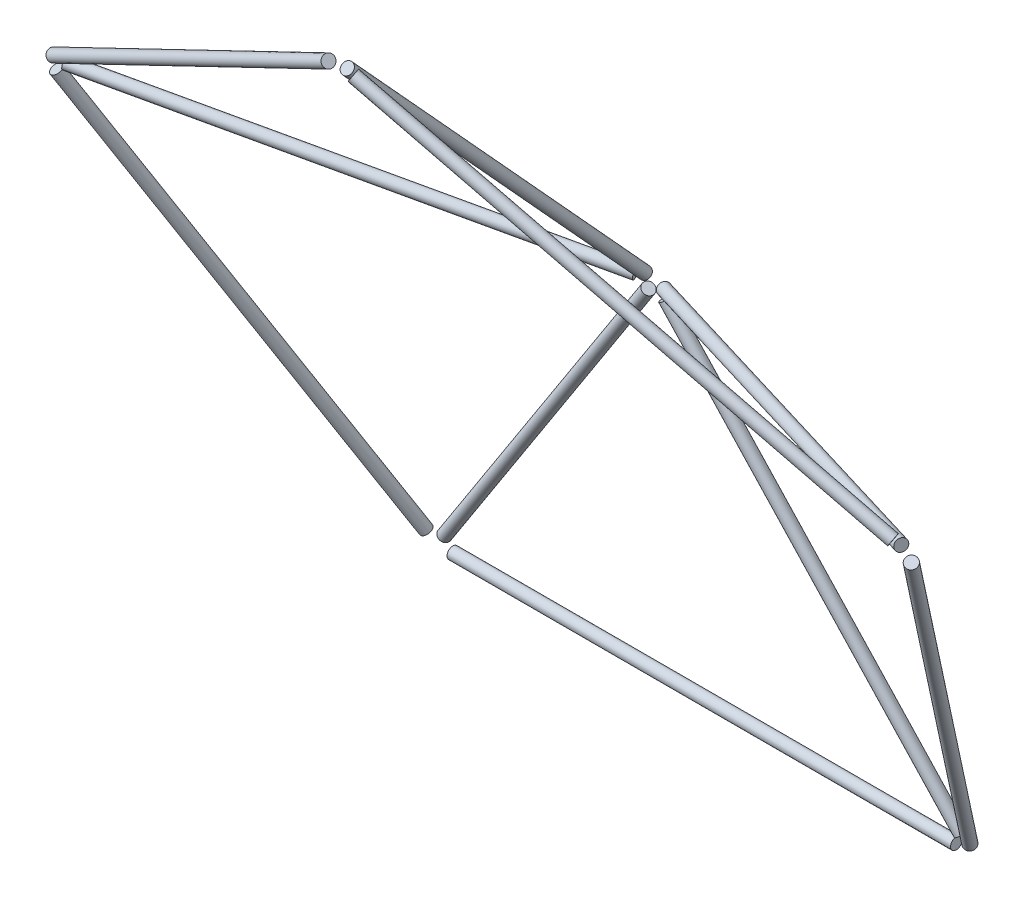
ISO-10303-21;
HEADER;
FILE_DESCRIPTION(('STEP AP214'),'2;1');
FILE_NAME('part.step','',(''),(''),'','','');
FILE_SCHEMA(('AUTOMOTIVE_DESIGN { 1 0 10303 214 1 1 1 1 }'));
ENDSEC;
DATA;
#1=APPLICATION_CONTEXT('core data for automotive mechanical design processes');
#2=APPLICATION_PROTOCOL_DEFINITION('international standard','automotive_design',2000,#1);
#3=PRODUCT_CONTEXT('',#1,'mechanical');
#4=PRODUCT('Part','Part','',(#3));
#5=PRODUCT_RELATED_PRODUCT_CATEGORY('part','',(#4));
#6=PRODUCT_DEFINITION_FORMATION('','',#4);
#7=PRODUCT_DEFINITION_CONTEXT('part definition',#1,'design');
#8=PRODUCT_DEFINITION('design','',#6,#7);
#9=PRODUCT_DEFINITION_SHAPE('','',#8);
#10=(LENGTH_UNIT() NAMED_UNIT(*) SI_UNIT(.MILLI.,.METRE.));
#11=(NAMED_UNIT(*) PLANE_ANGLE_UNIT() SI_UNIT($,.RADIAN.));
#12=(NAMED_UNIT(*) SI_UNIT($,.STERADIAN.) SOLID_ANGLE_UNIT());
#13=UNCERTAINTY_MEASURE_WITH_UNIT(LENGTH_MEASURE(1.E-05),#10,'distance_accuracy_value','');
#14=(GEOMETRIC_REPRESENTATION_CONTEXT(3) GLOBAL_UNCERTAINTY_ASSIGNED_CONTEXT((#13)) GLOBAL_UNIT_ASSIGNED_CONTEXT((#10,
#11,#12)) REPRESENTATION_CONTEXT('',''));
#15=CARTESIAN_POINT('',(0.,0.,0.));
#16=DIRECTION('',(0.,0.,1.));
#17=DIRECTION('',(1.,0.,0.));
#18=AXIS2_PLACEMENT_3D('',#15,#16,#17);
#19=CARTESIAN_POINT('',(3.23606797750099,189.293507430732,-119.340962451044));
#20=DIRECTION('',(0.809016994374942,-0.525731112119142,-0.262865556059568));
#21=DIRECTION('',(0.,0.447213595499955,-0.894427190999917));
#22=AXIS2_PLACEMENT_3D('',#19,#20,#21);
#23=PLANE('',#22);
#24=CARTESIAN_POINT('',(3.23606797750099,189.293507430732,-119.340962451044));
#25=DIRECTION('',(0.809016994374942,-0.525731112119142,-0.262865556059568));
#26=DIRECTION('',(0.,0.447213595499955,-0.894427190999917));
#27=AXIS2_PLACEMENT_3D('',#24,#25,#26);
#28=CIRCLE('',#27,1.49999999999999);
#29=CARTESIAN_POINT('',(3.23606797750099,189.964327823982,-120.682603237544));
#30=VERTEX_POINT('',#29);
#31=EDGE_CURVE('E52',#30,#30,#28,.T.);
#32=ORIENTED_EDGE('',*,*,#31,.F.);
#33=EDGE_LOOP('',(#32));
#34=FACE_BOUND('',#33,.T.);
#35=ADVANCED_FACE('F46',(#34),#23,.F.);
#36=CARTESIAN_POINT('',(109.263932022501,120.39242467528,-153.79150382877));
#37=DIRECTION('',(0.809016994374942,-0.525731112119142,-0.262865556059568));
#38=DIRECTION('',(0.,0.447213595499955,-0.894427190999917));
#39=AXIS2_PLACEMENT_3D('',#36,#37,#38);
#40=PLANE('',#39);
#41=CARTESIAN_POINT('',(109.263932022501,120.39242467528,-153.79150382877));
#42=DIRECTION('',(0.809016994374942,-0.525731112119142,-0.262865556059568));
#43=DIRECTION('',(0.,0.447213595499955,-0.894427190999917));
#44=AXIS2_PLACEMENT_3D('',#41,#42,#43);
#45=CIRCLE('',#44,1.49999999999999);
#46=CARTESIAN_POINT('',(109.263932022501,121.06324506853,-155.13314461527));
#47=VERTEX_POINT('',#46);
#48=EDGE_CURVE('E11',#47,#47,#45,.T.);
#49=ORIENTED_EDGE('',*,*,#48,.T.);
#50=EDGE_LOOP('',(#49));
#51=FACE_BOUND('',#50,.T.);
#52=ADVANCED_FACE('F61',(#51),#40,.T.);
#53=CARTESIAN_POINT('',(3.23606797750099,189.293507430732,-119.340962451044));
#54=DIRECTION('',(0.809016994374942,-0.525731112119141,-0.262865556059567));
#55=DIRECTION('',(0.,0.447213595499955,-0.894427190999917));
#56=AXIS2_PLACEMENT_3D('',#53,#54,#55);
#57=CYLINDRICAL_SURFACE('',#56,1.49999999999999);
#58=ORIENTED_EDGE('',*,*,#48,.F.);
#59=EDGE_LOOP('',(#58));
#60=FACE_BOUND('',#59,.T.);
#61=ORIENTED_EDGE('',*,*,#31,.T.);
#62=EDGE_LOOP('',(#61));
#63=FACE_BOUND('',#62,.T.);
#64=ADVANCED_FACE('F58',(#60,#63),#57,.T.);
#65=CLOSED_SHELL('',(#35,#52,#64));
#66=MANIFOLD_SOLID_BREP('B2',#65);
#67=CARTESIAN_POINT('',(-109.263932022499,120.392424675282,-153.791503828769));
#68=DIRECTION('',(0.809016994374952,0.525731112119127,0.262865556059566));
#69=DIRECTION('',(0.,0.447213595499955,-0.894427190999917));
#70=AXIS2_PLACEMENT_3D('',#67,#68,#69);
#71=PLANE('',#70);
#72=CARTESIAN_POINT('',(-109.263932022499,120.392424675282,-153.791503828769));
#73=DIRECTION('',(0.809016994374952,0.525731112119127,0.262865556059566));
#74=DIRECTION('',(0.,0.447213595499955,-0.894427190999917));
#75=AXIS2_PLACEMENT_3D('',#72,#73,#74);
#76=CIRCLE('',#75,1.49999999999999);
#77=CARTESIAN_POINT('',(-109.263932022499,121.063245068532,-155.133144615269));
#78=VERTEX_POINT('',#77);
#79=EDGE_CURVE('E101',#78,#78,#76,.T.);
#80=ORIENTED_EDGE('',*,*,#79,.F.);
#81=EDGE_LOOP('',(#80));
#82=FACE_BOUND('',#81,.T.);
#83=ADVANCED_FACE('F95',(#82),#71,.F.);
#84=CARTESIAN_POINT('',(-3.23606797749813,189.293507430732,-119.340962451044));
#85=DIRECTION('',(0.809016994374952,0.525731112119127,0.262865556059566));
#86=DIRECTION('',(0.,0.447213595499955,-0.894427190999917));
#87=AXIS2_PLACEMENT_3D('',#84,#85,#86);
#88=PLANE('',#87);
#89=CARTESIAN_POINT('',(-3.23606797749813,189.293507430732,-119.340962451044));
#90=DIRECTION('',(0.809016994374952,0.525731112119127,0.262865556059566));
#91=DIRECTION('',(0.,0.447213595499955,-0.894427190999917));
#92=AXIS2_PLACEMENT_3D('',#89,#90,#91);
#93=CIRCLE('',#92,1.49999999999999);
#94=CARTESIAN_POINT('',(-3.23606797749813,189.964327823982,-120.682603237544));
#95=VERTEX_POINT('',#94);
#96=EDGE_CURVE('E45',#95,#95,#93,.T.);
#97=ORIENTED_EDGE('',*,*,#96,.T.);
#98=EDGE_LOOP('',(#97));
#99=FACE_BOUND('',#98,.T.);
#100=ADVANCED_FACE('F110',(#99),#88,.T.);
#101=CARTESIAN_POINT('',(-109.263932022499,120.392424675282,-153.791503828769));
#102=DIRECTION('',(0.809016994374951,0.525731112119128,0.262865556059566));
#103=DIRECTION('',(0.,0.447213595499955,-0.894427190999917));
#104=AXIS2_PLACEMENT_3D('',#101,#102,#103);
#105=CYLINDRICAL_SURFACE('',#104,1.49999999999999);
#106=CARTESIAN_POINT('',(-3.23606797749813,189.964327823982,-120.682603237544));
#107=CARTESIAN_POINT('',(-4.34052489463356,189.246608211946,-121.041463043562));
#108=CARTESIAN_POINT('',(-5.44498181176898,188.52888859991,-121.40032284958));
#109=CARTESIAN_POINT('',(-7.65389564603983,187.093449375838,-122.118042461616));
#110=CARTESIAN_POINT('',(-8.75835256317526,186.375729763802,-122.476902267634));
#111=CARTESIAN_POINT('',(-10.9672663974461,184.94029053973,-123.19462187967));
#112=CARTESIAN_POINT('',(-12.0717233145815,184.222570927695,-123.553481685688));
#113=CARTESIAN_POINT('',(-14.2806371488524,182.787131703623,-124.271201297724));
#114=CARTESIAN_POINT('',(-15.3850940659878,182.069412091587,-124.630061103742));
#115=CARTESIAN_POINT('',(-17.5940079002587,180.633972867515,-125.347780715778));
#116=CARTESIAN_POINT('',(-18.6984648173941,179.916253255479,-125.706640521796));
#117=CARTESIAN_POINT('',(-20.907378651665,178.480814031407,-126.424360133832));
#118=CARTESIAN_POINT('',(-22.0118355688004,177.763094419371,-126.78321993985));
#119=CARTESIAN_POINT('',(-24.2207494030712,176.327655195299,-127.500939551885));
#120=CARTESIAN_POINT('',(-25.3252063202067,175.609935583263,-127.859799357903));
#121=CARTESIAN_POINT('',(-27.5341201544775,174.174496359191,-128.577518969939));
#122=CARTESIAN_POINT('',(-28.6385770716129,173.456776747155,-128.936378775957));
#123=CARTESIAN_POINT('',(-30.8474909058838,172.021337523084,-129.654098387993));
#124=CARTESIAN_POINT('',(-31.9519478230192,171.303617911048,-130.012958194011));
#125=CARTESIAN_POINT('',(-34.1608616572901,169.868178686976,-130.730677806047));
#126=CARTESIAN_POINT('',(-35.2653185744255,169.15045907494,-131.089537612065));
#127=CARTESIAN_POINT('',(-37.4742324086964,167.715019850868,-131.807257224101));
#128=CARTESIAN_POINT('',(-38.5786893258318,166.997300238832,-132.166117030119));
#129=CARTESIAN_POINT('',(-40.7876031601026,165.56186101476,-132.883836642155));
#130=CARTESIAN_POINT('',(-41.8920600772381,164.844141402724,-133.242696448173));
#131=CARTESIAN_POINT('',(-44.1009739115089,163.408702178652,-133.960416060209));
#132=CARTESIAN_POINT('',(-45.2054308286443,162.690982566616,-134.319275866227));
#133=CARTESIAN_POINT('',(-47.4143446629152,161.255543342545,-135.036995478263));
#134=CARTESIAN_POINT('',(-48.5188015800506,160.537823730509,-135.395855284281));
#135=CARTESIAN_POINT('',(-50.7277154143215,159.102384506437,-136.113574896317));
#136=CARTESIAN_POINT('',(-51.8321723314569,158.384664894401,-136.472434702335));
#137=CARTESIAN_POINT('',(-54.0410861657277,156.949225670329,-137.190154314371));
#138=CARTESIAN_POINT('',(-55.1455430828632,156.231506058293,-137.549014120389));
#139=CARTESIAN_POINT('',(-57.354456917134,154.796066834221,-138.266733732425));
#140=CARTESIAN_POINT('',(-58.4589138342695,154.078347222185,-138.625593538443));
#141=CARTESIAN_POINT('',(-60.6678276685403,152.642907998113,-139.343313150479));
#142=CARTESIAN_POINT('',(-61.7722845856757,151.925188386077,-139.702172956496));
#143=CARTESIAN_POINT('',(-63.9811984199466,150.489749162005,-140.419892568532));
#144=CARTESIAN_POINT('',(-65.085655337082,149.77202954997,-140.77875237455));
#145=CARTESIAN_POINT('',(-67.2945691713529,148.336590325898,-141.496471986586));
#146=CARTESIAN_POINT('',(-68.3990260884883,147.618870713862,-141.855331792604));
#147=CARTESIAN_POINT('',(-70.6079399227591,146.18343148979,-142.57305140464));
#148=CARTESIAN_POINT('',(-71.7123968398946,145.465711877754,-142.931911210658));
#149=CARTESIAN_POINT('',(-73.9213106741654,144.030272653682,-143.649630822694));
#150=CARTESIAN_POINT('',(-75.0257675913008,143.312553041646,-144.008490628712));
#151=CARTESIAN_POINT('',(-77.2346814255717,141.877113817574,-144.726210240748));
#152=CARTESIAN_POINT('',(-78.3391383427071,141.159394205538,-145.085070046766));
#153=CARTESIAN_POINT('',(-80.548052176978,139.723954981466,-145.802789658802));
#154=CARTESIAN_POINT('',(-81.6525090941134,139.00623536943,-146.16164946482));
#155=CARTESIAN_POINT('',(-83.8614229283843,137.570796145359,-146.879369076856));
#156=CARTESIAN_POINT('',(-84.9658798455197,136.853076533323,-147.238228882874));
#157=CARTESIAN_POINT('',(-87.1747936797905,135.417637309251,-147.95594849491));
#158=CARTESIAN_POINT('',(-88.279250596926,134.699917697215,-148.314808300928));
#159=CARTESIAN_POINT('',(-90.4881644311968,133.264478473143,-149.032527912964));
#160=CARTESIAN_POINT('',(-91.5926213483322,132.546758861107,-149.391387718982));
#161=CARTESIAN_POINT('',(-93.8015351826031,131.111319637035,-150.109107331018));
#162=CARTESIAN_POINT('',(-94.9059920997385,130.393600024999,-150.467967137036));
#163=CARTESIAN_POINT('',(-97.1149059340094,128.958160800927,-151.185686749072));
#164=CARTESIAN_POINT('',(-98.2193628511448,128.240441188891,-151.54454655509));
#165=CARTESIAN_POINT('',(-100.428276685416,126.805001964819,-152.262266167126));
#166=CARTESIAN_POINT('',(-101.532733602551,126.087282352783,-152.621125973144));
#167=CARTESIAN_POINT('',(-103.741647436822,124.651843128712,-153.338845585179));
#168=CARTESIAN_POINT('',(-104.846104353957,123.934123516676,-153.697705391197));
#169=CARTESIAN_POINT('',(-107.055018188228,122.498684292604,-154.415425003233));
#170=CARTESIAN_POINT('',(-108.159475105364,121.780964680568,-154.774284809251));
#171=CARTESIAN_POINT('',(-109.263932022499,121.063245068532,-155.133144615269));
#172=B_SPLINE_CURVE_WITH_KNOTS('',3,(#106,#107,#108,#109,#110,#111,#112,#113,#114,#115,#116,
#117,#118,#119,#120,#121,#122,#123,#124,#125,#126,#127,#128,#129,#130,#131,#132,#133,#134,#135,
#136,#137,#138,#139,#140,#141,#142,#143,#144,#145,#146,#147,#148,#149,#150,#151,#152,#153,#154,
#155,#156,#157,#158,#159,#160,#161,#162,#163,#164,#165,#166,#167,#168,#169,#170,#171),
.UNSPECIFIED.,.F.,.F.,(4,2,2,2,2,2,2,2,2,2,2,2,2,2,2,2,2,2,2,2,2,2,2,2,2,2,2,2,2,2,2,2,4),(0.,
4.09555148339769,8.19110296679541,12.2866544501931,16.3822059335908,20.4777574169885,
24.5733089003862,28.6688603837839,32.7644118671816,36.8599633505793,40.955514833977,
45.0510663173747,49.1466178007724,53.2421692841701,57.3377207675678,61.4332722509655,
65.5288237343632,69.6243752177609,73.7199267011586,77.8154781845563,81.911029667954,
86.0065811513517,90.1021326347494,94.1976841181471,98.2932356015448,102.388787084942,
106.48433856834,110.579890051738,114.675441535136,118.770993018533,122.866544501931,
126.962095985329,131.057647468726),.UNSPECIFIED.);
#173=EDGE_CURVE('BSEAM107',#95,#78,#172,.T.);
#174=ORIENTED_EDGE('',*,*,#96,.F.);
#175=ORIENTED_EDGE('',*,*,#79,.T.);
#176=ORIENTED_EDGE('',*,*,#173,.T.);
#177=ORIENTED_EDGE('',*,*,#173,.F.);
#178=EDGE_LOOP('',(#174,#176,#175,#177));
#179=FACE_BOUND('',#178,.T.);
#180=ADVANCED_FACE('F107',(#179),#105,.T.);
#181=CLOSED_SHELL('',(#83,#100,#180));
#182=MANIFOLD_SOLID_BREP('B6',#181);
#183=CARTESIAN_POINT('',(-70.7648917118622,3.40260323340869,-212.286414549706));
#184=DIRECTION('',(-0.309016994374944,0.850650808352041,0.425325404176019));
#185=DIRECTION('',(0.,0.447213595499958,-0.894427190999916));
#186=AXIS2_PLACEMENT_3D('',#183,#184,#185);
#187=PLANE('',#186);
#188=CARTESIAN_POINT('',(-70.7648917118622,3.40260323340869,-212.286414549706));
#189=DIRECTION('',(-0.309016994374944,0.850650808352041,0.425325404176019));
#190=DIRECTION('',(0.,0.447213595499958,-0.894427190999916));
#191=AXIS2_PLACEMENT_3D('',#188,#189,#190);
#192=CIRCLE('',#191,1.49999999999999);
#193=CARTESIAN_POINT('',(-70.7648917118622,4.07342362665862,-213.628055336206));
#194=VERTEX_POINT('',#193);
#195=EDGE_CURVE('E150',#194,#194,#192,.T.);
#196=ORIENTED_EDGE('',*,*,#195,.F.);
#197=EDGE_LOOP('',(#196));
#198=FACE_BOUND('',#197,.T.);
#199=ADVANCED_FACE('F144',(#198),#187,.F.);
#200=CARTESIAN_POINT('',(-111.263932022499,114.886896993398,-156.544267669712));
#201=DIRECTION('',(-0.309016994374944,0.850650808352041,0.425325404176019));
#202=DIRECTION('',(0.,0.447213595499958,-0.894427190999916));
#203=AXIS2_PLACEMENT_3D('',#200,#201,#202);
#204=PLANE('',#203);
#205=CARTESIAN_POINT('',(-111.263932022499,114.886896993398,-156.544267669712));
#206=DIRECTION('',(-0.309016994374944,0.850650808352041,0.425325404176019));
#207=DIRECTION('',(0.,0.447213595499958,-0.894427190999916));
#208=AXIS2_PLACEMENT_3D('',#205,#206,#207);
#209=CIRCLE('',#208,1.49999999999999);
#210=CARTESIAN_POINT('',(-111.263932022499,115.557717386648,-157.885908456211));
#211=VERTEX_POINT('',#210);
#212=EDGE_CURVE('E94',#211,#211,#209,.T.);
#213=ORIENTED_EDGE('',*,*,#212,.T.);
#214=EDGE_LOOP('',(#213));
#215=FACE_BOUND('',#214,.T.);
#216=ADVANCED_FACE('F159',(#215),#204,.T.);
#217=CARTESIAN_POINT('',(-70.7648917118622,3.40260323340869,-212.286414549706));
#218=DIRECTION('',(-0.309016994374944,0.850650808352041,0.425325404176019));
#219=DIRECTION('',(0.,0.447213595499958,-0.894427190999916));
#220=AXIS2_PLACEMENT_3D('',#217,#218,#219);
#221=CYLINDRICAL_SURFACE('',#220,1.49999999999999);
#222=CARTESIAN_POINT('',(-111.263932022499,115.557717386648,-157.885908456211));
#223=CARTESIAN_POINT('',(-110.842067019263,114.396422659981,-158.466555819545));
#224=CARTESIAN_POINT('',(-110.420202016027,113.235127933314,-159.047203182878));
#225=CARTESIAN_POINT('',(-109.576472009556,110.912538479981,-160.208497909545));
#226=CARTESIAN_POINT('',(-109.15460700632,109.751243753315,-160.789145272878));
#227=CARTESIAN_POINT('',(-108.310876999848,107.428654299982,-161.950439999544));
#228=CARTESIAN_POINT('',(-107.889011996613,106.267359573315,-162.531087362878));
#229=CARTESIAN_POINT('',(-107.045281990141,103.944770119982,-163.692382089544));
#230=CARTESIAN_POINT('',(-106.623416986905,102.783475393315,-164.273029452877));
#231=CARTESIAN_POINT('',(-105.779686980434,100.460885939982,-165.434324179544));
#232=CARTESIAN_POINT('',(-105.357821977198,99.2995912133158,-166.014971542877));
#233=CARTESIAN_POINT('',(-104.514091970726,96.9770017599827,-167.176266269544));
#234=CARTESIAN_POINT('',(-104.09222696749,95.8157070333162,-167.756913632877));
#235=CARTESIAN_POINT('',(-103.248496961019,93.493117579983,-168.918208359544));
#236=CARTESIAN_POINT('',(-102.826631957783,92.3318228533165,-169.498855722877));
#237=CARTESIAN_POINT('',(-101.982901951311,90.0092333999834,-170.660150449543));
#238=CARTESIAN_POINT('',(-101.561036948076,88.8479386733168,-171.240797812877));
#239=CARTESIAN_POINT('',(-100.717306941604,86.5253492199837,-172.402092539543));
#240=CARTESIAN_POINT('',(-100.295441938368,85.3640544933172,-172.982739902877));
#241=CARTESIAN_POINT('',(-99.4517119318967,83.0414650399841,-174.144034629543));
#242=CARTESIAN_POINT('',(-99.0298469286609,81.8801703133175,-174.724681992876));
#243=CARTESIAN_POINT('',(-98.1861169221892,79.5575808599844,-175.885976719543));
#244=CARTESIAN_POINT('',(-97.7642519189534,78.3962861333179,-176.466624082876));
#245=CARTESIAN_POINT('',(-96.9205219124818,76.0736966799848,-177.627918809543));
#246=CARTESIAN_POINT('',(-96.498656909246,74.9124019533183,-178.208566172876));
#247=CARTESIAN_POINT('',(-95.6549269027744,72.5898124999851,-179.369860899543));
#248=CARTESIAN_POINT('',(-95.2330618995386,71.4285177733186,-179.950508262876));
#249=CARTESIAN_POINT('',(-94.389331893067,69.1059283199855,-181.111802989542));
#250=CARTESIAN_POINT('',(-93.9674668898312,67.9446335933189,-181.692450352876));
#251=CARTESIAN_POINT('',(-93.1237368833597,65.6220441399858,-182.853745079542));
#252=CARTESIAN_POINT('',(-92.7018718801239,64.4607494133193,-183.434392442875));
#253=CARTESIAN_POINT('',(-91.8581418736522,62.1381599599862,-184.595687169542));
#254=CARTESIAN_POINT('',(-91.4362768704164,60.9768652333196,-185.176334532875));
#255=CARTESIAN_POINT('',(-90.5925468639448,58.6542757799865,-186.337629259542));
#256=CARTESIAN_POINT('',(-90.1706818607091,57.49298105332,-186.918276622875));
#257=CARTESIAN_POINT('',(-89.3269518542374,55.1703915999869,-188.079571349542));
#258=CARTESIAN_POINT('',(-88.9050868510016,54.0090968733203,-188.660218712875));
#259=CARTESIAN_POINT('',(-88.06135684453,51.6865074199872,-189.821513439541));
#260=CARTESIAN_POINT('',(-87.6394918412942,50.5252126933207,-190.402160802875));
#261=CARTESIAN_POINT('',(-86.7957618348226,48.2026232399876,-191.563455529541));
#262=CARTESIAN_POINT('',(-86.3738968315868,47.041328513321,-192.144102892875));
#263=CARTESIAN_POINT('',(-85.5301668251152,44.7187390599879,-193.305397619541));
#264=CARTESIAN_POINT('',(-85.1083018218794,43.5574443333214,-193.886044982874));
#265=CARTESIAN_POINT('',(-84.2645718154078,41.2348548799883,-195.047339709541));
#266=CARTESIAN_POINT('',(-83.842706812172,40.0735601533217,-195.627987072874));
#267=CARTESIAN_POINT('',(-82.9989768057004,37.7509706999886,-196.789281799541));
#268=CARTESIAN_POINT('',(-82.5771118024646,36.5896759733221,-197.369929162874));
#269=CARTESIAN_POINT('',(-81.733381795993,34.267086519989,-198.531223889541));
#270=CARTESIAN_POINT('',(-81.3115167927572,33.1057917933224,-199.111871252874));
#271=CARTESIAN_POINT('',(-80.4677867862856,30.7832023399893,-200.27316597954));
#272=CARTESIAN_POINT('',(-80.0459217830498,29.6219076133227,-200.853813342874));
#273=CARTESIAN_POINT('',(-79.2021917765782,27.2993181599896,-202.01510806954));
#274=CARTESIAN_POINT('',(-78.7803267733424,26.1380234333231,-202.595755432874));
#275=CARTESIAN_POINT('',(-77.9365967668708,23.81543397999,-203.75705015954));
#276=CARTESIAN_POINT('',(-77.514731763635,22.6541392533234,-204.337697522873));
#277=CARTESIAN_POINT('',(-76.6710017571634,20.3315497999903,-205.49899224954));
#278=CARTESIAN_POINT('',(-76.2491367539276,19.1702550733238,-206.079639612873));
#279=CARTESIAN_POINT('',(-75.405406747456,16.8476656199907,-207.24093433954));
#280=CARTESIAN_POINT('',(-74.9835417442202,15.6863708933241,-207.821581702873));
#281=CARTESIAN_POINT('',(-74.1398117377486,13.363781439991,-208.98287642954));
#282=CARTESIAN_POINT('',(-73.7179467345128,12.2024867133245,-209.563523792873));
#283=CARTESIAN_POINT('',(-72.8742167280412,9.87989725999137,-210.724818519539));
#284=CARTESIAN_POINT('',(-72.4523517248054,8.71860253332482,-211.305465882873));
#285=CARTESIAN_POINT('',(-71.6086217183338,6.39601307999172,-212.466760609539));
#286=CARTESIAN_POINT('',(-71.186756715098,5.23471835332517,-213.047407972872));
#287=CARTESIAN_POINT('',(-70.7648917118622,4.07342362665862,-213.628055336206));
#288=B_SPLINE_CURVE_WITH_KNOTS('',3,(#222,#223,#224,#225,#226,#227,#228,#229,#230,#231,#232,
#233,#234,#235,#236,#237,#238,#239,#240,#241,#242,#243,#244,#245,#246,#247,#248,#249,#250,#251,
#252,#253,#254,#255,#256,#257,#258,#259,#260,#261,#262,#263,#264,#265,#266,#267,#268,#269,#270,
#271,#272,#273,#274,#275,#276,#277,#278,#279,#280,#281,#282,#283,#284,#285,#286,#287),
.UNSPECIFIED.,.F.,.F.,(4,2,2,2,2,2,2,2,2,2,2,2,2,2,2,2,2,2,2,2,2,2,2,2,2,2,2,2,2,2,2,2,4),(0.,
4.09555148339769,8.1911029667954,12.2866544501931,16.3822059335908,20.4777574169885,
24.5733089003862,28.6688603837839,32.7644118671816,36.8599633505793,40.955514833977,
45.0510663173747,49.1466178007724,53.2421692841701,57.3377207675678,61.4332722509655,
65.5288237343632,69.6243752177609,73.7199267011586,77.8154781845563,81.911029667954,
86.0065811513516,90.1021326347493,94.197684118147,98.2932356015447,102.388787084942,
106.48433856834,110.579890051738,114.675441535136,118.770993018533,122.866544501931,
126.962095985329,131.057647468726),.UNSPECIFIED.);
#289=EDGE_CURVE('BSEAM156',#211,#194,#288,.T.);
#290=ORIENTED_EDGE('',*,*,#212,.F.);
#291=ORIENTED_EDGE('',*,*,#195,.T.);
#292=ORIENTED_EDGE('',*,*,#289,.T.);
#293=ORIENTED_EDGE('',*,*,#289,.F.);
#294=EDGE_LOOP('',(#290,#292,#291,#293));
#295=FACE_BOUND('',#294,.T.);
#296=ADVANCED_FACE('F156',(#295),#221,.T.);
#297=CLOSED_SHELL('',(#199,#216,#296));
#298=MANIFOLD_SOLID_BREP('B40',#297);
#299=CARTESIAN_POINT('',(65.5288237343635,3.88578058618805E-13,-213.98771616641));
#300=DIRECTION('',(-1.,0.,0.));
#301=DIRECTION('',(0.,0.447213595499959,-0.894427190999915));
#302=AXIS2_PLACEMENT_3D('',#299,#300,#301);
#303=PLANE('',#302);
#304=CARTESIAN_POINT('',(65.5288237343635,3.88578058618805E-13,-213.98771616641));
#305=DIRECTION('',(-1.,0.,0.));
#306=DIRECTION('',(0.,0.447213595499959,-0.894427190999915));
#307=AXIS2_PLACEMENT_3D('',#304,#305,#306);
#308=CIRCLE('',#307,1.49999999999999);
#309=CARTESIAN_POINT('',(65.5288237343635,0.670820393250324,-215.329356952909));
#310=VERTEX_POINT('',#309);
#311=EDGE_CURVE('E199',#310,#310,#308,.T.);
#312=ORIENTED_EDGE('',*,*,#311,.F.);
#313=EDGE_LOOP('',(#312));
#314=FACE_BOUND('',#313,.T.);
#315=ADVANCED_FACE('F193',(#314),#303,.F.);
#316=CARTESIAN_POINT('',(-65.5288237343629,5.759281940243E-13,-213.98771616641));
#317=DIRECTION('',(-1.,0.,0.));
#318=DIRECTION('',(0.,0.447213595499959,-0.894427190999915));
#319=AXIS2_PLACEMENT_3D('',#316,#317,#318);
#320=PLANE('',#319);
#321=CARTESIAN_POINT('',(-65.5288237343629,5.759281940243E-13,-213.98771616641));
#322=DIRECTION('',(-1.,0.,0.));
#323=DIRECTION('',(0.,0.447213595499959,-0.894427190999915));
#324=AXIS2_PLACEMENT_3D('',#321,#322,#323);
#325=CIRCLE('',#324,1.49999999999999);
#326=CARTESIAN_POINT('',(-65.5288237343629,0.670820393250508,-215.32935695291));
#327=VERTEX_POINT('',#326);
#328=EDGE_CURVE('E143',#327,#327,#325,.T.);
#329=ORIENTED_EDGE('',*,*,#328,.T.);
#330=EDGE_LOOP('',(#329));
#331=FACE_BOUND('',#330,.T.);
#332=ADVANCED_FACE('F208',(#331),#320,.T.);
#333=CARTESIAN_POINT('',(65.5288237343635,3.88578058618805E-13,-213.98771616641));
#334=DIRECTION('',(-1.,0.,0.));
#335=DIRECTION('',(0.,0.447213595499959,-0.894427190999915));
#336=AXIS2_PLACEMENT_3D('',#333,#334,#335);
#337=CYLINDRICAL_SURFACE('',#336,1.49999999999999);
#338=CARTESIAN_POINT('',(-65.5288237343629,0.670820393250508,-215.32935695291));
#339=CARTESIAN_POINT('',(-64.1636399065636,0.670820393250506,-215.32935695291));
#340=CARTESIAN_POINT('',(-62.7984560787644,0.670820393250504,-215.32935695291));
#341=CARTESIAN_POINT('',(-60.068088423166,0.6708203932505,-215.32935695291));
#342=CARTESIAN_POINT('',(-58.7029045953667,0.670820393250498,-215.32935695291));
#343=CARTESIAN_POINT('',(-55.9725369397682,0.670820393250494,-215.32935695291));
#344=CARTESIAN_POINT('',(-54.607353111969,0.670820393250493,-215.32935695291));
#345=CARTESIAN_POINT('',(-51.8769854563705,0.670820393250489,-215.32935695291));
#346=CARTESIAN_POINT('',(-50.5118016285713,0.670820393250487,-215.32935695291));
#347=CARTESIAN_POINT('',(-47.7814339729728,0.670820393250483,-215.32935695291));
#348=CARTESIAN_POINT('',(-46.4162501451736,0.670820393250481,-215.32935695291));
#349=CARTESIAN_POINT('',(-43.6858824895751,0.670820393250477,-215.32935695291));
#350=CARTESIAN_POINT('',(-42.3206986617759,0.670820393250475,-215.32935695291));
#351=CARTESIAN_POINT('',(-39.5903310061774,0.670820393250472,-215.32935695291));
#352=CARTESIAN_POINT('',(-38.2251471783782,0.67082039325047,-215.32935695291));
#353=CARTESIAN_POINT('',(-35.4947795227797,0.670820393250466,-215.32935695291));
#354=CARTESIAN_POINT('',(-34.1295956949805,0.670820393250464,-215.32935695291));
#355=CARTESIAN_POINT('',(-31.399228039382,0.67082039325046,-215.32935695291));
#356=CARTESIAN_POINT('',(-30.0340442115828,0.670820393250458,-215.32935695291));
#357=CARTESIAN_POINT('',(-27.3036765559843,0.670820393250454,-215.32935695291));
#358=CARTESIAN_POINT('',(-25.9384927281851,0.670820393250453,-215.32935695291));
#359=CARTESIAN_POINT('',(-23.2081250725867,0.670820393250449,-215.32935695291));
#360=CARTESIAN_POINT('',(-21.8429412447874,0.670820393250447,-215.32935695291));
#361=CARTESIAN_POINT('',(-19.112573589189,0.670820393250443,-215.32935695291));
#362=CARTESIAN_POINT('',(-17.7473897613897,0.670820393250441,-215.32935695291));
#363=CARTESIAN_POINT('',(-15.0170221057913,0.670820393250437,-215.32935695291));
#364=CARTESIAN_POINT('',(-13.651838277992,0.670820393250435,-215.32935695291));
#365=CARTESIAN_POINT('',(-10.9214706223936,0.670820393250431,-215.32935695291));
#366=CARTESIAN_POINT('',(-9.55628679459433,0.67082039325043,-215.32935695291));
#367=CARTESIAN_POINT('',(-6.82591913899586,0.670820393250426,-215.32935695291));
#368=CARTESIAN_POINT('',(-5.46073531119663,0.670820393250424,-215.32935695291));
#369=CARTESIAN_POINT('',(-2.73036765559816,0.67082039325042,-215.32935695291));
#370=CARTESIAN_POINT('',(-1.36518382779893,0.670820393250418,-215.32935695291));
#371=CARTESIAN_POINT('',(1.36518382779954,0.670820393250414,-215.32935695291));
#372=CARTESIAN_POINT('',(2.73036765559877,0.670820393250412,-215.32935695291));
#373=CARTESIAN_POINT('',(5.46073531119724,0.670820393250408,-215.32935695291));
#374=CARTESIAN_POINT('',(6.82591913899647,0.670820393250407,-215.32935695291));
#375=CARTESIAN_POINT('',(9.55628679459494,0.670820393250403,-215.32935695291));
#376=CARTESIAN_POINT('',(10.9214706223942,0.670820393250401,-215.32935695291));
#377=CARTESIAN_POINT('',(13.6518382779926,0.670820393250397,-215.32935695291));
#378=CARTESIAN_POINT('',(15.0170221057919,0.670820393250395,-215.32935695291));
#379=CARTESIAN_POINT('',(17.7473897613903,0.670820393250391,-215.32935695291));
#380=CARTESIAN_POINT('',(19.1125735891896,0.670820393250389,-215.32935695291));
#381=CARTESIAN_POINT('',(21.842941244788,0.670820393250385,-215.32935695291));
#382=CARTESIAN_POINT('',(23.2081250725873,0.670820393250383,-215.329356952909));
#383=CARTESIAN_POINT('',(25.9384927281857,0.67082039325038,-215.329356952909));
#384=CARTESIAN_POINT('',(27.303676555985,0.670820393250378,-215.329356952909));
#385=CARTESIAN_POINT('',(30.0340442115834,0.670820393250374,-215.329356952909));
#386=CARTESIAN_POINT('',(31.3992280393827,0.670820393250372,-215.329356952909));
#387=CARTESIAN_POINT('',(34.1295956949811,0.670820393250368,-215.329356952909));
#388=CARTESIAN_POINT('',(35.4947795227804,0.670820393250366,-215.329356952909));
#389=CARTESIAN_POINT('',(38.2251471783788,0.670820393250363,-215.329356952909));
#390=CARTESIAN_POINT('',(39.5903310061781,0.670820393250361,-215.329356952909));
#391=CARTESIAN_POINT('',(42.3206986617765,0.670820393250357,-215.329356952909));
#392=CARTESIAN_POINT('',(43.6858824895758,0.670820393250355,-215.329356952909));
#393=CARTESIAN_POINT('',(46.4162501451742,0.670820393250351,-215.329356952909));
#394=CARTESIAN_POINT('',(47.7814339729735,0.670820393250349,-215.329356952909));
#395=CARTESIAN_POINT('',(50.5118016285719,0.670820393250345,-215.329356952909));
#396=CARTESIAN_POINT('',(51.8769854563712,0.670820393250343,-215.329356952909));
#397=CARTESIAN_POINT('',(54.6073531119696,0.67082039325034,-215.329356952909));
#398=CARTESIAN_POINT('',(55.9725369397689,0.670820393250338,-215.329356952909));
#399=CARTESIAN_POINT('',(58.7029045953673,0.670820393250334,-215.329356952909));
#400=CARTESIAN_POINT('',(60.0680884231666,0.670820393250332,-215.329356952909));
#401=CARTESIAN_POINT('',(62.798456078765,0.670820393250328,-215.329356952909));
#402=CARTESIAN_POINT('',(64.1636399065643,0.670820393250326,-215.329356952909));
#403=CARTESIAN_POINT('',(65.5288237343635,0.670820393250324,-215.329356952909));
#404=B_SPLINE_CURVE_WITH_KNOTS('',3,(#338,#339,#340,#341,#342,#343,#344,#345,#346,#347,#348,
#349,#350,#351,#352,#353,#354,#355,#356,#357,#358,#359,#360,#361,#362,#363,#364,#365,#366,#367,
#368,#369,#370,#371,#372,#373,#374,#375,#376,#377,#378,#379,#380,#381,#382,#383,#384,#385,#386,
#387,#388,#389,#390,#391,#392,#393,#394,#395,#396,#397,#398,#399,#400,#401,#402,#403),
.UNSPECIFIED.,.F.,.F.,(4,2,2,2,2,2,2,2,2,2,2,2,2,2,2,2,2,2,2,2,2,2,2,2,2,2,2,2,2,2,2,2,4),(0.,
4.09555148339769,8.1911029667954,12.2866544501931,16.3822059335908,20.4777574169885,
24.5733089003862,28.6688603837839,32.7644118671816,36.8599633505793,40.955514833977,
45.0510663173747,49.1466178007724,53.2421692841701,57.3377207675678,61.4332722509655,
65.5288237343632,69.6243752177609,73.7199267011586,77.8154781845563,81.911029667954,
86.0065811513517,90.1021326347494,94.1976841181471,98.2932356015448,102.388787084942,
106.48433856834,110.579890051738,114.675441535136,118.770993018533,122.866544501931,
126.962095985329,131.057647468726),.UNSPECIFIED.);
#405=EDGE_CURVE('BSEAM205',#327,#310,#404,.T.);
#406=ORIENTED_EDGE('',*,*,#328,.F.);
#407=ORIENTED_EDGE('',*,*,#311,.T.);
#408=ORIENTED_EDGE('',*,*,#405,.T.);
#409=ORIENTED_EDGE('',*,*,#405,.F.);
#410=EDGE_LOOP('',(#406,#408,#407,#409));
#411=FACE_BOUND('',#410,.T.);
#412=ADVANCED_FACE('F205',(#411),#337,.T.);
#413=CLOSED_SHELL('',(#315,#332,#412));
#414=MANIFOLD_SOLID_BREP('B89',#413);
#415=CARTESIAN_POINT('',(3.65943097377883,101.197717852091,-199.736703473433));
#416=DIRECTION('',(0.914857743444657,0.143664716150186,0.377353625387166));
#417=DIRECTION('',(-0.229343174999498,0.954060902804784,0.192793936161049));
#418=AXIS2_PLACEMENT_3D('',#415,#416,#417);
#419=PLANE('',#418);
#420=CARTESIAN_POINT('',(3.65943097377883,101.197717852091,-199.736703473433));
#421=DIRECTION('',(0.914857743444657,0.143664716150186,0.377353625387166));
#422=DIRECTION('',(-0.229343174999498,0.954060902804784,0.192793936161049));
#423=AXIS2_PLACEMENT_3D('',#420,#421,#422);
#424=CIRCLE('',#423,1.5);
#425=CARTESIAN_POINT('',(3.31541621127958,102.628809206298,-199.447512569191));
#426=VERTEX_POINT('',#425);
#427=EDGE_CURVE('E248',#426,#426,#424,.T.);
#428=ORIENTED_EDGE('',*,*,#427,.F.);
#429=EDGE_LOOP('',(#428));
#430=FACE_BOUND('',#429,.T.);
#431=ADVANCED_FACE('F242',(#430),#419,.F.);
#432=CARTESIAN_POINT('',(108.840569026222,117.714841362203,-156.352380554557));
#433=DIRECTION('',(0.914857743444657,0.143664716150186,0.377353625387166));
#434=DIRECTION('',(-0.229343174999498,0.954060902804784,0.192793936161049));
#435=AXIS2_PLACEMENT_3D('',#432,#433,#434);
#436=PLANE('',#435);
#437=CARTESIAN_POINT('',(108.840569026222,117.714841362203,-156.352380554557));
#438=DIRECTION('',(0.914857743444657,0.143664716150186,0.377353625387166));
#439=DIRECTION('',(-0.229343174999498,0.954060902804784,0.192793936161049));
#440=AXIS2_PLACEMENT_3D('',#437,#438,#439);
#441=CIRCLE('',#440,1.5);
#442=CARTESIAN_POINT('',(108.496554263723,119.14593271641,-156.063189650315));
#443=VERTEX_POINT('',#442);
#444=EDGE_CURVE('E192',#443,#443,#441,.T.);
#445=ORIENTED_EDGE('',*,*,#444,.T.);
#446=EDGE_LOOP('',(#445));
#447=FACE_BOUND('',#446,.T.);
#448=ADVANCED_FACE('F257',(#447),#436,.T.);
#449=CARTESIAN_POINT('',(3.65943097377883,101.197717852091,-199.736703473433));
#450=DIRECTION('',(0.914857743444656,0.143664716150186,0.377353625387166));
#451=DIRECTION('',(-0.229343174999498,0.954060902804784,0.192793936161049));
#452=AXIS2_PLACEMENT_3D('',#449,#450,#451);
#453=CYLINDRICAL_SURFACE('',#452,1.5);
#454=ORIENTED_EDGE('',*,*,#444,.F.);
#455=EDGE_LOOP('',(#454));
#456=FACE_BOUND('',#455,.T.);
#457=ORIENTED_EDGE('',*,*,#427,.T.);
#458=EDGE_LOOP('',(#457));
#459=FACE_BOUND('',#458,.T.);
#460=ADVANCED_FACE('F254',(#456,#459),#453,.T.);
#461=CLOSED_SHELL('',(#431,#448,#460));
#462=MANIFOLD_SOLID_BREP('B138',#461);
#463=CARTESIAN_POINT('',(9.15933995315754E-13,103.575760252862,-198.547682273048));
#464=DIRECTION('',(0.,0.738175316342914,0.674608925483527));
#465=DIRECTION('',(-0.964443775627103,0.178291116075976,-0.195090957203356));
#466=AXIS2_PLACEMENT_3D('',#463,#464,#465);
#467=PLANE('',#466);
#468=CARTESIAN_POINT('',(9.15933995315754E-13,103.575760252862,-198.547682273048));
#469=DIRECTION('',(0.,0.738175316342914,0.674608925483527));
#470=DIRECTION('',(-0.964443775627103,0.178291116075976,-0.195090957203356));
#471=AXIS2_PLACEMENT_3D('',#468,#469,#470);
#472=CIRCLE('',#471,1.5);
#473=CARTESIAN_POINT('',(-1.44666566343973,103.843196926976,-198.840318708853));
#474=VERTEX_POINT('',#473);
#475=EDGE_CURVE('E297',#474,#474,#472,.T.);
#476=ORIENTED_EDGE('',*,*,#475,.F.);
#477=EDGE_LOOP('',(#476));
#478=FACE_BOUND('',#477,.T.);
#479=ADVANCED_FACE('F291',(#478),#467,.F.);
#480=CARTESIAN_POINT('',(1.67227343084164E-12,188.443730613837,-120.98793592874));
#481=DIRECTION('',(0.,0.738175316342914,0.674608925483527));
#482=DIRECTION('',(-0.964443775627103,0.178291116075976,-0.195090957203356));
#483=AXIS2_PLACEMENT_3D('',#480,#481,#482);
#484=PLANE('',#483);
#485=CARTESIAN_POINT('',(1.67227343084164E-12,188.443730613837,-120.98793592874));
#486=DIRECTION('',(0.,0.738175316342914,0.674608925483527));
#487=DIRECTION('',(-0.964443775627103,0.178291116075976,-0.195090957203356));
#488=AXIS2_PLACEMENT_3D('',#485,#486,#487);
#489=CIRCLE('',#488,1.5);
#490=CARTESIAN_POINT('',(-1.44666566343898,188.711167287951,-121.280572364545));
#491=VERTEX_POINT('',#490);
#492=EDGE_CURVE('E241',#491,#491,#489,.T.);
#493=ORIENTED_EDGE('',*,*,#492,.T.);
#494=EDGE_LOOP('',(#493));
#495=FACE_BOUND('',#494,.T.);
#496=ADVANCED_FACE('F306',(#495),#484,.T.);
#497=CARTESIAN_POINT('',(9.15933995315754E-13,103.575760252862,-198.547682273048));
#498=DIRECTION('',(0.,0.738175316342914,0.674608925483527));
#499=DIRECTION('',(-0.964443775627103,0.178291116075976,-0.195090957203356));
#500=AXIS2_PLACEMENT_3D('',#497,#498,#499);
#501=CYLINDRICAL_SURFACE('',#500,1.5);
#502=ORIENTED_EDGE('',*,*,#492,.F.);
#503=EDGE_LOOP('',(#502));
#504=FACE_BOUND('',#503,.T.);
#505=ORIENTED_EDGE('',*,*,#475,.T.);
#506=EDGE_LOOP('',(#505));
#507=FACE_BOUND('',#506,.T.);
#508=ADVANCED_FACE('F303',(#504,#507),#501,.T.);
#509=CLOSED_SHELL('',(#479,#496,#508));
#510=MANIFOLD_SOLID_BREP('B187',#509);
#511=CARTESIAN_POINT('',(-3.65943097377752,101.197717852091,-199.736703473433));
#512=DIRECTION('',(-0.914857743444654,0.1436647161502,0.377353625387168));
#513=DIRECTION('',(-0.366715858576323,-0.686748851889796,-0.627610941186239));
#514=AXIS2_PLACEMENT_3D('',#511,#512,#513);
#515=PLANE('',#514);
#516=CARTESIAN_POINT('',(-3.65943097377752,101.197717852091,-199.736703473433));
#517=DIRECTION('',(-0.914857743444654,0.1436647161502,0.377353625387168));
#518=DIRECTION('',(-0.366715858576323,-0.686748851889796,-0.627610941186239));
#519=AXIS2_PLACEMENT_3D('',#516,#517,#518);
#520=CIRCLE('',#519,1.5);
#521=CARTESIAN_POINT('',(-4.209504761642,100.167594574257,-200.678119885212));
#522=VERTEX_POINT('',#521);
#523=EDGE_CURVE('E346',#522,#522,#520,.T.);
#524=ORIENTED_EDGE('',*,*,#523,.F.);
#525=EDGE_LOOP('',(#524));
#526=FACE_BOUND('',#525,.T.);
#527=ADVANCED_FACE('F340',(#526),#515,.F.);
#528=CARTESIAN_POINT('',(-108.84056902622,117.714841362205,-156.352380554556));
#529=DIRECTION('',(-0.914857743444654,0.1436647161502,0.377353625387168));
#530=DIRECTION('',(-0.366715858576323,-0.686748851889796,-0.627610941186239));
#531=AXIS2_PLACEMENT_3D('',#528,#529,#530);
#532=PLANE('',#531);
#533=CARTESIAN_POINT('',(-108.84056902622,117.714841362205,-156.352380554556));
#534=DIRECTION('',(-0.914857743444654,0.1436647161502,0.377353625387168));
#535=DIRECTION('',(-0.366715858576323,-0.686748851889796,-0.627610941186239));
#536=AXIS2_PLACEMENT_3D('',#533,#534,#535);
#537=CIRCLE('',#536,1.5);
#538=CARTESIAN_POINT('',(-109.390642814085,116.68471808437,-157.293796966336));
#539=VERTEX_POINT('',#538);
#540=EDGE_CURVE('E290',#539,#539,#537,.T.);
#541=ORIENTED_EDGE('',*,*,#540,.T.);
#542=EDGE_LOOP('',(#541));
#543=FACE_BOUND('',#542,.T.);
#544=ADVANCED_FACE('F355',(#543),#532,.T.);
#545=CARTESIAN_POINT('',(-3.65943097377752,101.197717852091,-199.736703473433));
#546=DIRECTION('',(-0.914857743444654,0.1436647161502,0.377353625387168));
#547=DIRECTION('',(-0.366715858576323,-0.686748851889797,-0.627610941186239));
#548=AXIS2_PLACEMENT_3D('',#545,#546,#547);
#549=CYLINDRICAL_SURFACE('',#548,1.5);
#550=ORIENTED_EDGE('',*,*,#540,.F.);
#551=EDGE_LOOP('',(#550));
#552=FACE_BOUND('',#551,.T.);
#553=ORIENTED_EDGE('',*,*,#523,.T.);
#554=EDGE_LOOP('',(#553));
#555=FACE_BOUND('',#554,.T.);
#556=ADVANCED_FACE('F352',(#552,#555),#549,.T.);
#557=CLOSED_SHELL('',(#527,#544,#556));
#558=MANIFOLD_SOLID_BREP('B236',#557);
#559=CARTESIAN_POINT('',(-2.2616527212788,97.349964420956,-201.660580189));
#560=DIRECTION('',(-0.565413180319829,-0.818273641633721,-0.103615553504791));
#561=DIRECTION('',(0.737800910813338,-0.445603166990951,-0.507038098736814));
#562=AXIS2_PLACEMENT_3D('',#559,#560,#561);
#563=PLANE('',#562);
#564=CARTESIAN_POINT('',(-2.2616527212788,97.349964420956,-201.660580189));
#565=DIRECTION('',(-0.565413180319829,-0.818273641633721,-0.103615553504791));
#566=DIRECTION('',(0.737800910813338,-0.445603166990951,-0.507038098736814));
#567=AXIS2_PLACEMENT_3D('',#564,#565,#566);
#568=CIRCLE('',#567,1.5);
#569=CARTESIAN_POINT('',(-1.1549513550588,96.6815596704696,-202.421137337106));
#570=VERTEX_POINT('',#569);
#571=EDGE_CURVE('E395',#570,#570,#568,.T.);
#572=ORIENTED_EDGE('',*,*,#571,.F.);
#573=EDGE_LOOP('',(#572));
#574=FACE_BOUND('',#573,.T.);
#575=ADVANCED_FACE('F389',(#574),#563,.F.);
#576=CARTESIAN_POINT('',(-67.2671710130836,3.27309456653548,-213.573253952391));
#577=DIRECTION('',(-0.565413180319829,-0.818273641633721,-0.103615553504791));
#578=DIRECTION('',(0.737800910813338,-0.445603166990951,-0.507038098736814));
#579=AXIS2_PLACEMENT_3D('',#576,#577,#578);
#580=PLANE('',#579);
#581=CARTESIAN_POINT('',(-67.2671710130836,3.27309456653548,-213.573253952391));
#582=DIRECTION('',(-0.565413180319829,-0.818273641633721,-0.103615553504791));
#583=DIRECTION('',(0.737800910813338,-0.445603166990951,-0.507038098736814));
#584=AXIS2_PLACEMENT_3D('',#581,#582,#583);
#585=CIRCLE('',#584,1.5);
#586=CARTESIAN_POINT('',(-66.1604696468636,2.60468981604907,-214.333811100496));
#587=VERTEX_POINT('',#586);
#588=EDGE_CURVE('E339',#587,#587,#585,.T.);
#589=ORIENTED_EDGE('',*,*,#588,.T.);
#590=EDGE_LOOP('',(#589));
#591=FACE_BOUND('',#590,.T.);
#592=ADVANCED_FACE('F404',(#591),#580,.T.);
#593=CARTESIAN_POINT('',(-2.2616527212788,97.349964420956,-201.660580189));
#594=DIRECTION('',(-0.565413180319829,-0.818273641633721,-0.103615553504791));
#595=DIRECTION('',(0.737800910813339,-0.445603166990951,-0.507038098736814));
#596=AXIS2_PLACEMENT_3D('',#593,#594,#595);
#597=CYLINDRICAL_SURFACE('',#596,1.5);
#598=CARTESIAN_POINT('',(-66.1604696468636,2.60468981604907,-214.333811100496));
#599=CARTESIAN_POINT('',(-65.483328831324,3.58465721036596,-214.209720748794));
#600=CARTESIAN_POINT('',(-64.8061880157843,4.56462460468284,-214.085630397092));
#601=CARTESIAN_POINT('',(-63.4519063847051,6.5245593933166,-213.837449693688));
#602=CARTESIAN_POINT('',(-62.7747655691654,7.50452678763347,-213.713359341986));
#603=CARTESIAN_POINT('',(-61.4204839380862,9.46446157626723,-213.465178638582));
#604=CARTESIAN_POINT('',(-60.7433431225465,10.4444289705841,-213.34108828688));
#605=CARTESIAN_POINT('',(-59.3890614914673,12.4043637592179,-213.092907583476));
#606=CARTESIAN_POINT('',(-58.7119206759276,13.3843311535348,-212.968817231774));
#607=CARTESIAN_POINT('',(-57.3576390448484,15.3442659421685,-212.72063652837));
#608=CARTESIAN_POINT('',(-56.6804982293087,16.3242333364854,-212.596546176668));
#609=CARTESIAN_POINT('',(-55.3262165982295,18.2841681251192,-212.348365473264));
#610=CARTESIAN_POINT('',(-54.6490757826898,19.264135519436,-212.224275121562));
#611=CARTESIAN_POINT('',(-53.2947941516106,21.2240703080698,-211.976094418158));
#612=CARTESIAN_POINT('',(-52.6176533360709,22.2040377023867,-211.852004066456));
#613=CARTESIAN_POINT('',(-51.2633717049917,24.1639724910204,-211.603823363052));
#614=CARTESIAN_POINT('',(-50.586230889452,25.1439398853373,-211.47973301135));
#615=CARTESIAN_POINT('',(-49.2319492583728,27.1038746739711,-211.231552307946));
#616=CARTESIAN_POINT('',(-48.5548084428331,28.083842068288,-211.107461956244));
#617=CARTESIAN_POINT('',(-47.2005268117539,30.0437768569217,-210.85928125284));
#618=CARTESIAN_POINT('',(-46.5233859962142,31.0237442512386,-210.735190901138));
#619=CARTESIAN_POINT('',(-45.169104365135,32.9836790398724,-210.487010197734));
#620=CARTESIAN_POINT('',(-44.4919635495953,33.9636464341893,-210.362919846032));
#621=CARTESIAN_POINT('',(-43.1376819185161,35.923581222823,-210.114739142628));
#622=CARTESIAN_POINT('',(-42.4605411029764,36.9035486171399,-209.990648790926));
#623=CARTESIAN_POINT('',(-41.1062594718972,38.8634834057737,-209.742468087522));
#624=CARTESIAN_POINT('',(-40.4291186563575,39.8434508000905,-209.618377735821));
#625=CARTESIAN_POINT('',(-39.0748370252783,41.8033855887243,-209.370197032417));
#626=CARTESIAN_POINT('',(-38.3976962097386,42.7833529830412,-209.246106680715));
#627=CARTESIAN_POINT('',(-37.0434145786594,44.7432877716749,-208.997925977311));
#628=CARTESIAN_POINT('',(-36.3662737631197,45.7232551659918,-208.873835625609));
#629=CARTESIAN_POINT('',(-35.0119921320405,47.6831899546256,-208.625654922205));
#630=CARTESIAN_POINT('',(-34.3348513165008,48.6631573489424,-208.501564570503));
#631=CARTESIAN_POINT('',(-32.9805696854216,50.6230921375762,-208.253383867099));
#632=CARTESIAN_POINT('',(-32.3034288698819,51.6030595318931,-208.129293515397));
#633=CARTESIAN_POINT('',(-30.9491472388027,53.5629943205269,-207.881112811993));
#634=CARTESIAN_POINT('',(-30.272006423263,54.5429617148437,-207.757022460291));
#635=CARTESIAN_POINT('',(-28.9177247921838,56.5028965034775,-207.508841756887));
#636=CARTESIAN_POINT('',(-28.2405839766441,57.4828638977944,-207.384751405185));
#637=CARTESIAN_POINT('',(-26.8863023455649,59.4427986864281,-207.136570701781));
#638=CARTESIAN_POINT('',(-26.2091615300252,60.422766080745,-207.012480350079));
#639=CARTESIAN_POINT('',(-24.854879898946,62.3827008693788,-206.764299646675));
#640=CARTESIAN_POINT('',(-24.1777390834063,63.3626682636957,-206.640209294973));
#641=CARTESIAN_POINT('',(-22.8234574523271,65.3226030523294,-206.392028591569));
#642=CARTESIAN_POINT('',(-22.1463166367874,66.3025704466463,-206.267938239867));
#643=CARTESIAN_POINT('',(-20.7920350057082,68.2625052352801,-206.019757536463));
#644=CARTESIAN_POINT('',(-20.1148941901685,69.2424726295969,-205.895667184761));
#645=CARTESIAN_POINT('',(-18.7606125590893,71.2024074182307,-205.647486481357));
#646=CARTESIAN_POINT('',(-18.0834717435496,72.1823748125476,-205.523396129655));
#647=CARTESIAN_POINT('',(-16.7291901124704,74.1423096011813,-205.275215426251));
#648=CARTESIAN_POINT('',(-16.0520492969307,75.1222769954982,-205.151125074549));
#649=CARTESIAN_POINT('',(-14.6977676658515,77.082211784132,-204.902944371145));
#650=CARTESIAN_POINT('',(-14.0206268503118,78.0621791784489,-204.778854019443));
#651=CARTESIAN_POINT('',(-12.6663452192326,80.0221139670826,-204.530673316039));
#652=CARTESIAN_POINT('',(-11.9892044036929,81.0020813613995,-204.406582964337));
#653=CARTESIAN_POINT('',(-10.6349227726137,82.9620161500333,-204.158402260933));
#654=CARTESIAN_POINT('',(-9.95778195707404,83.9419835443502,-204.034311909231));
#655=CARTESIAN_POINT('',(-8.60350032599477,85.9019183329839,-203.786131205827));
#656=CARTESIAN_POINT('',(-7.92635951045514,86.8818857273008,-203.662040854125));
#657=CARTESIAN_POINT('',(-6.57207787937587,88.8418205159345,-203.413860150721));
#658=CARTESIAN_POINT('',(-5.89493706383624,89.8217879102514,-203.289769799019));
#659=CARTESIAN_POINT('',(-4.54065543275697,91.7817226988852,-203.041589095615));
#660=CARTESIAN_POINT('',(-3.86351461721734,92.7616900932021,-202.917498743913));
#661=CARTESIAN_POINT('',(-2.50923298613808,94.7216248818359,-202.669318040509));
#662=CARTESIAN_POINT('',(-1.83209217059844,95.7015922761527,-202.545227688808));
#663=CARTESIAN_POINT('',(-1.15495135505881,96.6815596704696,-202.421137337106));
#664=B_SPLINE_CURVE_WITH_KNOTS('',3,(#598,#599,#600,#601,#602,#603,#604,#605,#606,#607,#608,
#609,#610,#611,#612,#613,#614,#615,#616,#617,#618,#619,#620,#621,#622,#623,#624,#625,#626,#627,
#628,#629,#630,#631,#632,#633,#634,#635,#636,#637,#638,#639,#640,#641,#642,#643,#644,#645,#646,
#647,#648,#649,#650,#651,#652,#653,#654,#655,#656,#657,#658,#659,#660,#661,#662,#663),
.UNSPECIFIED.,.F.,.F.,(4,2,2,2,2,2,2,2,2,2,2,2,2,2,2,2,2,2,2,2,2,2,2,2,2,2,2,2,2,2,2,2,4),(0.,
3.59281056283445,7.1856211256689,10.7784316885033,14.3712422513378,17.9640528141722,
21.5568633770067,25.1496739398411,28.7424845026756,32.33529506551,35.9281056283445,
39.5209161911789,43.1137267540133,46.7065373168478,50.2993478796822,53.8921584425167,
57.4849690053511,61.0777795681856,64.67059013102,68.2634006938545,71.8562112566889,
75.4490218195234,79.0418323823578,82.6346429451922,86.2274535080267,89.8202640708611,
93.4130746336956,97.00588519653,100.598695759364,104.191506322199,107.784316885033,
111.377127447868,114.969938010702),.UNSPECIFIED.);
#665=EDGE_CURVE('BSEAM401',#587,#570,#664,.T.);
#666=ORIENTED_EDGE('',*,*,#588,.F.);
#667=ORIENTED_EDGE('',*,*,#571,.T.);
#668=ORIENTED_EDGE('',*,*,#665,.T.);
#669=ORIENTED_EDGE('',*,*,#665,.F.);
#670=EDGE_LOOP('',(#666,#668,#667,#669));
#671=FACE_BOUND('',#670,.T.);
#672=ADVANCED_FACE('F401',(#671),#597,.T.);
#673=CLOSED_SHELL('',(#575,#592,#672));
#674=MANIFOLD_SOLID_BREP('B285',#673);
#675=CARTESIAN_POINT('',(111.2639320225,114.886896993397,-156.544267669711));
#676=DIRECTION('',(-0.309016994374946,-0.850650808352041,-0.42532540417602));
#677=DIRECTION('',(0.,0.447213595499957,-0.894427190999916));
#678=AXIS2_PLACEMENT_3D('',#675,#676,#677);
#679=PLANE('',#678);
#680=CARTESIAN_POINT('',(111.2639320225,114.886896993397,-156.544267669711));
#681=DIRECTION('',(-0.309016994374946,-0.850650808352041,-0.42532540417602));
#682=DIRECTION('',(0.,0.447213595499957,-0.894427190999916));
#683=AXIS2_PLACEMENT_3D('',#680,#681,#682);
#684=CIRCLE('',#683,1.49999999999999);
#685=CARTESIAN_POINT('',(111.2639320225,115.557717386647,-157.885908456211));
#686=VERTEX_POINT('',#685);
#687=EDGE_CURVE('E444',#686,#686,#684,.T.);
#688=ORIENTED_EDGE('',*,*,#687,.F.);
#689=EDGE_LOOP('',(#688));
#690=FACE_BOUND('',#689,.T.);
#691=ADVANCED_FACE('F438',(#690),#679,.F.);
#692=CARTESIAN_POINT('',(70.764891711863,3.40260323340823,-212.286414549706));
#693=DIRECTION('',(-0.309016994374946,-0.850650808352041,-0.42532540417602));
#694=DIRECTION('',(0.,0.447213595499957,-0.894427190999916));
#695=AXIS2_PLACEMENT_3D('',#692,#693,#694);
#696=PLANE('',#695);
#697=CARTESIAN_POINT('',(70.764891711863,3.40260323340823,-212.286414549706));
#698=DIRECTION('',(-0.309016994374946,-0.850650808352041,-0.42532540417602));
#699=DIRECTION('',(0.,0.447213595499957,-0.894427190999916));
#700=AXIS2_PLACEMENT_3D('',#697,#698,#699);
#701=CIRCLE('',#700,1.49999999999999);
#702=CARTESIAN_POINT('',(70.764891711863,4.07342362665816,-213.628055336205));
#703=VERTEX_POINT('',#702);
#704=EDGE_CURVE('E388',#703,#703,#701,.T.);
#705=ORIENTED_EDGE('',*,*,#704,.T.);
#706=EDGE_LOOP('',(#705));
#707=FACE_BOUND('',#706,.T.);
#708=ADVANCED_FACE('F453',(#707),#696,.T.);
#709=CARTESIAN_POINT('',(111.2639320225,114.886896993397,-156.544267669711));
#710=DIRECTION('',(-0.309016994374945,-0.850650808352041,-0.42532540417602));
#711=DIRECTION('',(0.,0.447213595499957,-0.894427190999916));
#712=AXIS2_PLACEMENT_3D('',#709,#710,#711);
#713=CYLINDRICAL_SURFACE('',#712,1.49999999999999);
#714=ORIENTED_EDGE('',*,*,#704,.F.);
#715=EDGE_LOOP('',(#714));
#716=FACE_BOUND('',#715,.T.);
#717=ORIENTED_EDGE('',*,*,#687,.T.);
#718=EDGE_LOOP('',(#717));
#719=FACE_BOUND('',#718,.T.);
#720=ADVANCED_FACE('F450',(#716,#719),#713,.T.);
#721=CLOSED_SHELL('',(#691,#708,#720));
#722=MANIFOLD_SOLID_BREP('B334',#721);
#723=CARTESIAN_POINT('',(2.26165272127931,97.3499644209557,-201.660580189));
#724=DIRECTION('',(0.565413180319828,-0.818273641633723,-0.103615553504788));
#725=DIRECTION('',(0.822701898389593,0.568473030482678,0.));
#726=AXIS2_PLACEMENT_3D('',#723,#724,#725);
#727=PLANE('',#726);
#728=CARTESIAN_POINT('',(2.26165272127931,97.3499644209557,-201.660580189));
#729=DIRECTION('',(0.565413180319828,-0.818273641633723,-0.103615553504788));
#730=DIRECTION('',(0.822701898389593,0.568473030482678,0.));
#731=AXIS2_PLACEMENT_3D('',#728,#729,#730);
#732=CIRCLE('',#731,1.5);
#733=CARTESIAN_POINT('',(3.49570556886369,98.2026739666797,-201.660580189));
#734=VERTEX_POINT('',#733);
#735=EDGE_CURVE('E495',#734,#734,#732,.T.);
#736=ORIENTED_EDGE('',*,*,#735,.F.);
#737=EDGE_LOOP('',(#736));
#738=FACE_BOUND('',#737,.T.);
#739=ADVANCED_FACE('F489',(#738),#727,.F.);
#740=CARTESIAN_POINT('',(67.2671710130839,3.27309456653493,-213.573253952391));
#741=DIRECTION('',(0.565413180319828,-0.818273641633723,-0.103615553504788));
#742=DIRECTION('',(0.822701898389593,0.568473030482678,0.));
#743=AXIS2_PLACEMENT_3D('',#740,#741,#742);
#744=PLANE('',#743);
#745=CARTESIAN_POINT('',(67.2671710130839,3.27309456653493,-213.573253952391));
#746=DIRECTION('',(0.565413180319828,-0.818273641633723,-0.103615553504788));
#747=DIRECTION('',(0.822701898389593,0.568473030482678,0.));
#748=AXIS2_PLACEMENT_3D('',#745,#746,#747);
#749=CIRCLE('',#748,1.5);
#750=CARTESIAN_POINT('',(68.5012238606683,4.12580411225895,-213.573253952391));
#751=VERTEX_POINT('',#750);
#752=EDGE_CURVE('E437',#751,#751,#749,.T.);
#753=ORIENTED_EDGE('',*,*,#752,.T.);
#754=EDGE_LOOP('',(#753));
#755=FACE_BOUND('',#754,.T.);
#756=ADVANCED_FACE('F504',(#755),#744,.T.);
#757=CARTESIAN_POINT('',(2.26165272127931,97.3499644209557,-201.660580189));
#758=DIRECTION('',(0.565413180319828,-0.818273641633723,-0.103615553504788));
#759=DIRECTION('',(0.822701898389593,0.568473030482678,0.));
#760=AXIS2_PLACEMENT_3D('',#757,#758,#759);
#761=CYLINDRICAL_SURFACE('',#760,1.5);
#762=ORIENTED_EDGE('',*,*,#752,.F.);
#763=EDGE_LOOP('',(#762));
#764=FACE_BOUND('',#763,.T.);
#765=ORIENTED_EDGE('',*,*,#735,.T.);
#766=EDGE_LOOP('',(#765));
#767=FACE_BOUND('',#766,.T.);
#768=ADVANCED_FACE('F501',(#764,#767),#761,.T.);
#769=CLOSED_SHELL('',(#739,#756,#768));
#770=MANIFOLD_SOLID_BREP('B383',#769);
#771=ADVANCED_BREP_SHAPE_REPRESENTATION('',(#18,#66,#182,#298,#414,#462,#510,#558,#674,#722,
#770),#14);
#772=SHAPE_DEFINITION_REPRESENTATION(#9,#771);
ENDSEC;
END-ISO-10303-21;
